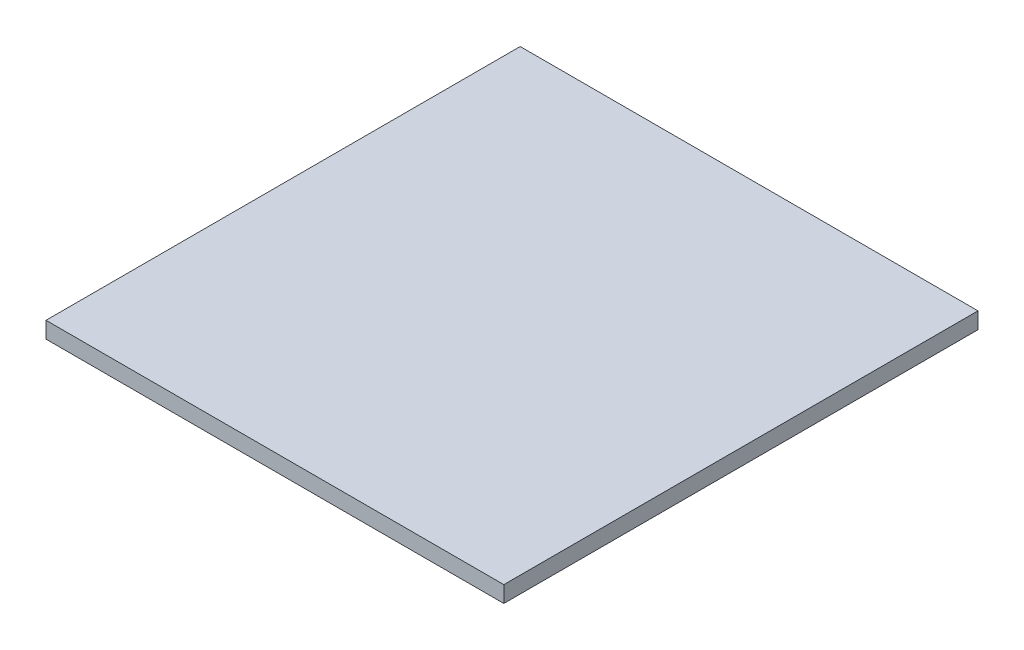
ISO-10303-21;
HEADER;
FILE_DESCRIPTION(('STEP AP214'),'2;1');
FILE_NAME('part.step','',(''),(''),'','','');
FILE_SCHEMA(('AUTOMOTIVE_DESIGN { 1 0 10303 214 1 1 1 1 }'));
ENDSEC;
DATA;
#1=APPLICATION_CONTEXT('core data for automotive mechanical design processes');
#2=APPLICATION_PROTOCOL_DEFINITION('international standard','automotive_design',2000,#1);
#3=PRODUCT_CONTEXT('',#1,'mechanical');
#4=PRODUCT('Part','Part','',(#3));
#5=PRODUCT_RELATED_PRODUCT_CATEGORY('part','',(#4));
#6=PRODUCT_DEFINITION_FORMATION('','',#4);
#7=PRODUCT_DEFINITION_CONTEXT('part definition',#1,'design');
#8=PRODUCT_DEFINITION('design','',#6,#7);
#9=PRODUCT_DEFINITION_SHAPE('','',#8);
#10=(LENGTH_UNIT() NAMED_UNIT(*) SI_UNIT(.MILLI.,.METRE.));
#11=(NAMED_UNIT(*) PLANE_ANGLE_UNIT() SI_UNIT($,.RADIAN.));
#12=(NAMED_UNIT(*) SI_UNIT($,.STERADIAN.) SOLID_ANGLE_UNIT());
#13=UNCERTAINTY_MEASURE_WITH_UNIT(LENGTH_MEASURE(1.E-05),#10,'distance_accuracy_value','');
#14=(GEOMETRIC_REPRESENTATION_CONTEXT(3) GLOBAL_UNCERTAINTY_ASSIGNED_CONTEXT((#13)) GLOBAL_UNIT_ASSIGNED_CONTEXT((#10,
#11,#12)) REPRESENTATION_CONTEXT('',''));
#15=CARTESIAN_POINT('',(0.,0.,0.));
#16=DIRECTION('',(0.,0.,1.));
#17=DIRECTION('',(1.,0.,0.));
#18=AXIS2_PLACEMENT_3D('',#15,#16,#17);
#19=CARTESIAN_POINT('',(0.,0.,290.));
#20=DIRECTION('',(1.,0.,0.));
#21=DIRECTION('',(0.,0.,-1.));
#22=AXIS2_PLACEMENT_3D('',#19,#20,#21);
#23=PLANE('',#22);
#24=DIRECTION('',(0.,-1.,0.));
#25=VECTOR('',#24,1.);
#26=CARTESIAN_POINT('',(0.,0.,0.));
#27=LINE('',#26,#25);
#28=CARTESIAN_POINT('',(0.,0.,0.));
#29=VERTEX_POINT('',#28);
#30=CARTESIAN_POINT('',(0.,-10.,0.));
#31=VERTEX_POINT('',#30);
#32=EDGE_CURVE('E102',#29,#31,#27,.T.);
#33=ORIENTED_EDGE('',*,*,#32,.T.);
#34=DIRECTION('',(0.,0.,-1.));
#35=VECTOR('',#34,1.);
#36=CARTESIAN_POINT('',(0.,-10.,290.));
#37=LINE('',#36,#35);
#38=CARTESIAN_POINT('',(0.,-10.,290.));
#39=VERTEX_POINT('',#38);
#40=EDGE_CURVE('E11',#39,#31,#37,.T.);
#41=ORIENTED_EDGE('',*,*,#40,.F.);
#42=DIRECTION('',(0.,-1.,0.));
#43=VECTOR('',#42,1.);
#44=CARTESIAN_POINT('',(0.,0.,290.));
#45=LINE('',#44,#43);
#46=CARTESIAN_POINT('',(0.,0.,290.));
#47=VERTEX_POINT('',#46);
#48=EDGE_CURVE('E90',#47,#39,#45,.T.);
#49=ORIENTED_EDGE('',*,*,#48,.F.);
#50=DIRECTION('',(0.,0.,-1.));
#51=VECTOR('',#50,1.);
#52=CARTESIAN_POINT('',(0.,0.,290.));
#53=LINE('',#52,#51);
#54=EDGE_CURVE('E98',#47,#29,#53,.T.);
#55=ORIENTED_EDGE('',*,*,#54,.T.);
#56=EDGE_LOOP('',(#33,#41,#49,#55));
#57=FACE_BOUND('',#56,.T.);
#58=ADVANCED_FACE('F39',(#57),#23,.F.);
#59=CARTESIAN_POINT('',(0.,-10.,290.));
#60=DIRECTION('',(0.,1.,0.));
#61=DIRECTION('',(0.,0.,1.));
#62=AXIS2_PLACEMENT_3D('',#59,#60,#61);
#63=PLANE('',#62);
#64=DIRECTION('',(1.,0.,0.));
#65=VECTOR('',#64,1.);
#66=CARTESIAN_POINT('',(0.,-10.,0.));
#67=LINE('',#66,#65);
#68=CARTESIAN_POINT('',(280.,-10.,0.));
#69=VERTEX_POINT('',#68);
#70=EDGE_CURVE('E94',#31,#69,#67,.T.);
#71=ORIENTED_EDGE('',*,*,#70,.T.);
#72=DIRECTION('',(0.,0.,-1.));
#73=VECTOR('',#72,1.);
#74=CARTESIAN_POINT('',(280.,-10.,290.));
#75=LINE('',#74,#73);
#76=CARTESIAN_POINT('',(280.,-10.,290.));
#77=VERTEX_POINT('',#76);
#78=EDGE_CURVE('E47',#77,#69,#75,.T.);
#79=ORIENTED_EDGE('',*,*,#78,.F.);
#80=DIRECTION('',(1.,0.,0.));
#81=VECTOR('',#80,1.);
#82=CARTESIAN_POINT('',(0.,-10.,290.));
#83=LINE('',#82,#81);
#84=EDGE_CURVE('E85',#39,#77,#83,.T.);
#85=ORIENTED_EDGE('',*,*,#84,.F.);
#86=ORIENTED_EDGE('',*,*,#40,.T.);
#87=EDGE_LOOP('',(#71,#79,#85,#86));
#88=FACE_BOUND('',#87,.T.);
#89=ADVANCED_FACE('F93',(#88),#63,.F.);
#90=CARTESIAN_POINT('',(280.,0.,290.));
#91=DIRECTION('',(-1.,0.,0.));
#92=DIRECTION('',(0.,0.,1.));
#93=AXIS2_PLACEMENT_3D('',#90,#91,#92);
#94=PLANE('',#93);
#95=DIRECTION('',(0.,1.,0.));
#96=VECTOR('',#95,1.);
#97=CARTESIAN_POINT('',(280.,0.,0.));
#98=LINE('',#97,#96);
#99=CARTESIAN_POINT('',(280.,0.,0.));
#100=VERTEX_POINT('',#99);
#101=EDGE_CURVE('E72',#69,#100,#98,.T.);
#102=ORIENTED_EDGE('',*,*,#101,.T.);
#103=DIRECTION('',(0.,0.,-1.));
#104=VECTOR('',#103,1.);
#105=CARTESIAN_POINT('',(280.,0.,290.));
#106=LINE('',#105,#104);
#107=CARTESIAN_POINT('',(280.,0.,290.));
#108=VERTEX_POINT('',#107);
#109=EDGE_CURVE('E95',#108,#100,#106,.T.);
#110=ORIENTED_EDGE('',*,*,#109,.F.);
#111=DIRECTION('',(0.,1.,0.));
#112=VECTOR('',#111,1.);
#113=CARTESIAN_POINT('',(280.,0.,290.));
#114=LINE('',#113,#112);
#115=EDGE_CURVE('E88',#77,#108,#114,.T.);
#116=ORIENTED_EDGE('',*,*,#115,.F.);
#117=ORIENTED_EDGE('',*,*,#78,.T.);
#118=EDGE_LOOP('',(#102,#110,#116,#117));
#119=FACE_BOUND('',#118,.T.);
#120=ADVANCED_FACE('F96',(#119),#94,.F.);
#121=CARTESIAN_POINT('',(0.,0.,290.));
#122=DIRECTION('',(0.,-1.,0.));
#123=DIRECTION('',(0.,0.,-1.));
#124=AXIS2_PLACEMENT_3D('',#121,#122,#123);
#125=PLANE('',#124);
#126=DIRECTION('',(-1.,0.,0.));
#127=VECTOR('',#126,1.);
#128=CARTESIAN_POINT('',(0.,0.,0.));
#129=LINE('',#128,#127);
#130=EDGE_CURVE('E78',#100,#29,#129,.T.);
#131=ORIENTED_EDGE('',*,*,#130,.T.);
#132=ORIENTED_EDGE('',*,*,#54,.F.);
#133=DIRECTION('',(-1.,0.,0.));
#134=VECTOR('',#133,1.);
#135=CARTESIAN_POINT('',(0.,0.,290.));
#136=LINE('',#135,#134);
#137=EDGE_CURVE('E55',#108,#47,#136,.T.);
#138=ORIENTED_EDGE('',*,*,#137,.F.);
#139=ORIENTED_EDGE('',*,*,#109,.T.);
#140=EDGE_LOOP('',(#131,#132,#138,#139));
#141=FACE_BOUND('',#140,.T.);
#142=ADVANCED_FACE('F109',(#141),#125,.F.);
#143=CARTESIAN_POINT('',(0.,0.,290.));
#144=DIRECTION('',(0.,0.,1.));
#145=DIRECTION('',(1.,0.,0.));
#146=AXIS2_PLACEMENT_3D('',#143,#144,#145);
#147=PLANE('',#146);
#148=ORIENTED_EDGE('',*,*,#48,.T.);
#149=ORIENTED_EDGE('',*,*,#84,.T.);
#150=ORIENTED_EDGE('',*,*,#115,.T.);
#151=ORIENTED_EDGE('',*,*,#137,.T.);
#152=EDGE_LOOP('',(#148,#149,#150,#151));
#153=FACE_BOUND('',#152,.T.);
#154=ADVANCED_FACE('F86',(#153),#147,.T.);
#155=CARTESIAN_POINT('',(0.,0.,0.));
#156=DIRECTION('',(0.,0.,1.));
#157=DIRECTION('',(1.,0.,0.));
#158=AXIS2_PLACEMENT_3D('',#155,#156,#157);
#159=PLANE('',#158);
#160=ORIENTED_EDGE('',*,*,#32,.F.);
#161=ORIENTED_EDGE('',*,*,#130,.F.);
#162=ORIENTED_EDGE('',*,*,#101,.F.);
#163=ORIENTED_EDGE('',*,*,#70,.F.);
#164=EDGE_LOOP('',(#160,#161,#162,#163));
#165=FACE_BOUND('',#164,.T.);
#166=ADVANCED_FACE('F112',(#165),#159,.F.);
#167=CLOSED_SHELL('',(#58,#89,#120,#142,#154,#166));
#168=MANIFOLD_SOLID_BREP('B2',#167);
#169=ADVANCED_BREP_SHAPE_REPRESENTATION('',(#18,#168),#14);
#170=SHAPE_DEFINITION_REPRESENTATION(#9,#169);
ENDSEC;
END-ISO-10303-21;
